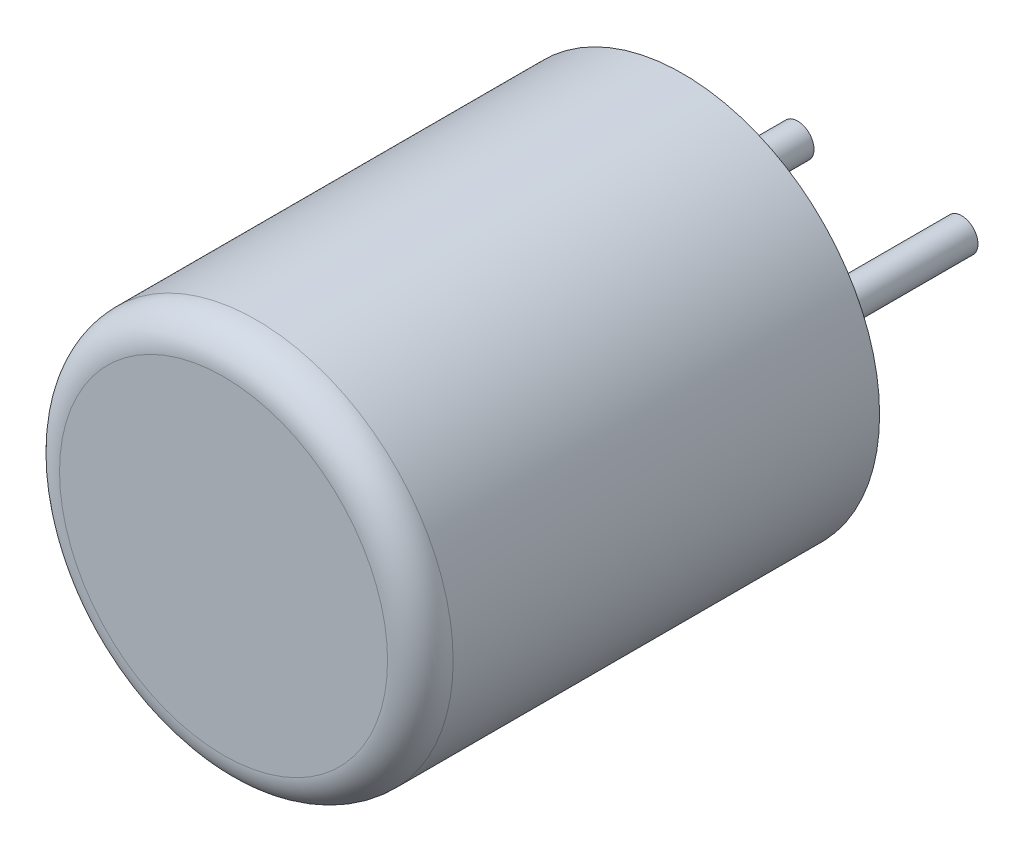
ISO-10303-21;
HEADER;
FILE_DESCRIPTION(('STEP AP214'),'2;1');
FILE_NAME('part.step','',(''),(''),'','','');
FILE_SCHEMA(('AUTOMOTIVE_DESIGN { 1 0 10303 214 1 1 1 1 }'));
ENDSEC;
DATA;
#1=APPLICATION_CONTEXT('core data for automotive mechanical design processes');
#2=APPLICATION_PROTOCOL_DEFINITION('international standard','automotive_design',2000,#1);
#3=PRODUCT_CONTEXT('',#1,'mechanical');
#4=PRODUCT('Part','Part','',(#3));
#5=PRODUCT_RELATED_PRODUCT_CATEGORY('part','',(#4));
#6=PRODUCT_DEFINITION_FORMATION('','',#4);
#7=PRODUCT_DEFINITION_CONTEXT('part definition',#1,'design');
#8=PRODUCT_DEFINITION('design','',#6,#7);
#9=PRODUCT_DEFINITION_SHAPE('','',#8);
#10=(LENGTH_UNIT() NAMED_UNIT(*) SI_UNIT(.MILLI.,.METRE.));
#11=(NAMED_UNIT(*) PLANE_ANGLE_UNIT() SI_UNIT($,.RADIAN.));
#12=(NAMED_UNIT(*) SI_UNIT($,.STERADIAN.) SOLID_ANGLE_UNIT());
#13=UNCERTAINTY_MEASURE_WITH_UNIT(LENGTH_MEASURE(1.E-05),#10,'distance_accuracy_value','');
#14=(GEOMETRIC_REPRESENTATION_CONTEXT(3) GLOBAL_UNCERTAINTY_ASSIGNED_CONTEXT((#13)) GLOBAL_UNIT_ASSIGNED_CONTEXT((#10,
#11,#12)) REPRESENTATION_CONTEXT('',''));
#15=CARTESIAN_POINT('',(0.,0.,0.));
#16=DIRECTION('',(0.,0.,1.));
#17=DIRECTION('',(1.,0.,0.));
#18=AXIS2_PLACEMENT_3D('',#15,#16,#17);
#19=CARTESIAN_POINT('',(0.,0.,0.));
#20=DIRECTION('',(0.,0.,1.));
#21=DIRECTION('',(1.,0.,0.));
#22=AXIS2_PLACEMENT_3D('',#19,#20,#21);
#23=PLANE('',#22);
#24=CARTESIAN_POINT('',(1.25,0.,0.));
#25=DIRECTION('',(0.,0.,1.));
#26=DIRECTION('',(1.,0.,0.));
#27=AXIS2_PLACEMENT_3D('',#24,#25,#26);
#28=CIRCLE('',#27,0.25);
#29=CARTESIAN_POINT('',(1.5,0.,0.));
#30=VERTEX_POINT('',#29);
#31=EDGE_CURVE('E44',#30,#30,#28,.F.);
#32=ORIENTED_EDGE('',*,*,#31,.F.);
#33=EDGE_LOOP('',(#32));
#34=FACE_BOUND('',#33,.T.);
#35=CARTESIAN_POINT('',(0.,0.,0.));
#36=DIRECTION('',(0.,0.,1.));
#37=DIRECTION('',(1.,0.,0.));
#38=AXIS2_PLACEMENT_3D('',#35,#36,#37);
#39=CIRCLE('',#38,3.);
#40=CARTESIAN_POINT('',(3.,0.,0.));
#41=VERTEX_POINT('',#40);
#42=EDGE_CURVE('E49',#41,#41,#39,.T.);
#43=ORIENTED_EDGE('',*,*,#42,.F.);
#44=EDGE_LOOP('',(#43));
#45=FACE_BOUND('',#44,.T.);
#46=CARTESIAN_POINT('',(-1.25,0.,0.));
#47=DIRECTION('',(0.,0.,1.));
#48=DIRECTION('',(1.,0.,0.));
#49=AXIS2_PLACEMENT_3D('',#46,#47,#48);
#50=CIRCLE('',#49,0.25);
#51=CARTESIAN_POINT('',(-1.,0.,0.));
#52=VERTEX_POINT('',#51);
#53=EDGE_CURVE('E40',#52,#52,#50,.F.);
#54=ORIENTED_EDGE('',*,*,#53,.F.);
#55=EDGE_LOOP('',(#54));
#56=FACE_BOUND('',#55,.T.);
#57=ADVANCED_FACE('F29',(#34,#45,#56),#23,.F.);
#58=CARTESIAN_POINT('',(0.,0.,7.));
#59=DIRECTION('',(0.,0.,-1.));
#60=DIRECTION('',(-1.,0.,0.));
#61=AXIS2_PLACEMENT_3D('',#58,#59,#60);
#62=CYLINDRICAL_SURFACE('',#61,3.);
#63=CARTESIAN_POINT('',(0.,0.,6.5));
#64=DIRECTION('',(0.,0.,1.));
#65=DIRECTION('',(1.,0.,0.));
#66=AXIS2_PLACEMENT_3D('',#63,#64,#65);
#67=CIRCLE('',#66,3.);
#68=CARTESIAN_POINT('',(3.,0.,6.5));
#69=VERTEX_POINT('',#68);
#70=EDGE_CURVE('E10',#69,#69,#67,.F.);
#71=ORIENTED_EDGE('',*,*,#70,.T.);
#72=EDGE_LOOP('',(#71));
#73=FACE_BOUND('',#72,.T.);
#74=ORIENTED_EDGE('',*,*,#42,.T.);
#75=EDGE_LOOP('',(#74));
#76=FACE_BOUND('',#75,.T.);
#77=ADVANCED_FACE('F69',(#73,#76),#62,.T.);
#78=CARTESIAN_POINT('',(0.,0.,7.));
#79=DIRECTION('',(0.,0.,1.));
#80=DIRECTION('',(1.,0.,0.));
#81=AXIS2_PLACEMENT_3D('',#78,#79,#80);
#82=PLANE('',#81);
#83=CARTESIAN_POINT('',(0.,0.,7.));
#84=DIRECTION('',(0.,0.,1.));
#85=DIRECTION('',(1.,0.,0.));
#86=AXIS2_PLACEMENT_3D('',#83,#84,#85);
#87=CIRCLE('',#86,2.5);
#88=CARTESIAN_POINT('',(2.5,0.,7.));
#89=VERTEX_POINT('',#88);
#90=EDGE_CURVE('E36',#89,#89,#87,.T.);
#91=ORIENTED_EDGE('',*,*,#90,.T.);
#92=EDGE_LOOP('',(#91));
#93=FACE_BOUND('',#92,.T.);
#94=ADVANCED_FACE('F75',(#93),#82,.T.);
#95=CARTESIAN_POINT('',(1.25,0.,-3.));
#96=DIRECTION('',(0.,0.,1.));
#97=DIRECTION('',(1.,0.,0.));
#98=AXIS2_PLACEMENT_3D('',#95,#96,#97);
#99=CYLINDRICAL_SURFACE('',#98,0.25);
#100=CARTESIAN_POINT('',(1.25,0.,-3.));
#101=DIRECTION('',(0.,0.,-1.));
#102=DIRECTION('',(-1.,0.,0.));
#103=AXIS2_PLACEMENT_3D('',#100,#101,#102);
#104=CIRCLE('',#103,0.25);
#105=CARTESIAN_POINT('',(1.,0.,-3.));
#106=VERTEX_POINT('',#105);
#107=EDGE_CURVE('E52',#106,#106,#104,.T.);
#108=ORIENTED_EDGE('',*,*,#107,.F.);
#109=EDGE_LOOP('',(#108));
#110=FACE_BOUND('',#109,.T.);
#111=ORIENTED_EDGE('',*,*,#31,.T.);
#112=EDGE_LOOP('',(#111));
#113=FACE_BOUND('',#112,.T.);
#114=ADVANCED_FACE('F81',(#110,#113),#99,.T.);
#115=CARTESIAN_POINT('',(1.25,0.,-3.));
#116=DIRECTION('',(0.,0.,-1.));
#117=DIRECTION('',(-1.,0.,0.));
#118=AXIS2_PLACEMENT_3D('',#115,#116,#117);
#119=PLANE('',#118);
#120=ORIENTED_EDGE('',*,*,#107,.T.);
#121=EDGE_LOOP('',(#120));
#122=FACE_BOUND('',#121,.T.);
#123=ADVANCED_FACE('F64',(#122),#119,.T.);
#124=CARTESIAN_POINT('',(-1.25,0.,-3.));
#125=DIRECTION('',(0.,0.,1.));
#126=DIRECTION('',(1.,0.,0.));
#127=AXIS2_PLACEMENT_3D('',#124,#125,#126);
#128=CYLINDRICAL_SURFACE('',#127,0.25);
#129=CARTESIAN_POINT('',(-1.25,0.,-3.));
#130=DIRECTION('',(0.,0.,-1.));
#131=DIRECTION('',(-1.,0.,0.));
#132=AXIS2_PLACEMENT_3D('',#129,#130,#131);
#133=CIRCLE('',#132,0.25);
#134=CARTESIAN_POINT('',(-1.5,0.,-3.));
#135=VERTEX_POINT('',#134);
#136=EDGE_CURVE('E55',#135,#135,#133,.T.);
#137=ORIENTED_EDGE('',*,*,#136,.F.);
#138=EDGE_LOOP('',(#137));
#139=FACE_BOUND('',#138,.T.);
#140=ORIENTED_EDGE('',*,*,#53,.T.);
#141=EDGE_LOOP('',(#140));
#142=FACE_BOUND('',#141,.T.);
#143=ADVANCED_FACE('F61',(#139,#142),#128,.T.);
#144=CARTESIAN_POINT('',(-1.25,0.,-3.));
#145=DIRECTION('',(0.,0.,-1.));
#146=DIRECTION('',(-1.,0.,0.));
#147=AXIS2_PLACEMENT_3D('',#144,#145,#146);
#148=PLANE('',#147);
#149=ORIENTED_EDGE('',*,*,#136,.T.);
#150=EDGE_LOOP('',(#149));
#151=FACE_BOUND('',#150,.T.);
#152=ADVANCED_FACE('F59',(#151),#148,.T.);
#153=CARTESIAN_POINT('',(0.,0.,6.5));
#154=DIRECTION('',(0.,0.,1.));
#155=DIRECTION('',(1.,0.,0.));
#156=AXIS2_PLACEMENT_3D('',#153,#154,#155);
#157=TOROIDAL_SURFACE('',#156,2.5,0.5);
#158=ORIENTED_EDGE('',*,*,#70,.F.);
#159=EDGE_LOOP('',(#158));
#160=FACE_BOUND('',#159,.T.);
#161=ORIENTED_EDGE('',*,*,#90,.F.);
#162=EDGE_LOOP('',(#161));
#163=FACE_BOUND('',#162,.T.);
#164=ADVANCED_FACE('F31',(#160,#163),#157,.T.);
#165=CLOSED_SHELL('',(#57,#77,#94,#114,#123,#143,#152,#164));
#166=MANIFOLD_SOLID_BREP('B2',#165);
#167=ADVANCED_BREP_SHAPE_REPRESENTATION('',(#18,#166),#14);
#168=SHAPE_DEFINITION_REPRESENTATION(#9,#167);
ENDSEC;
END-ISO-10303-21;
